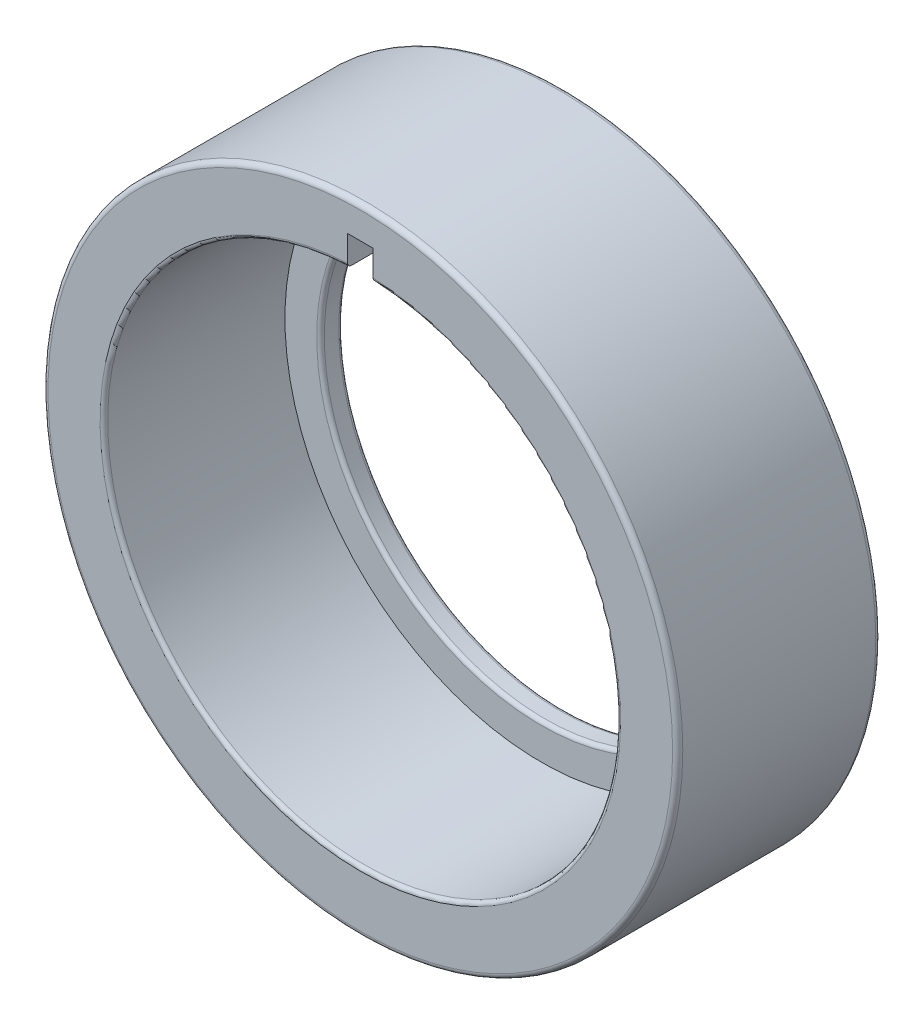
ISO-10303-21;
HEADER;
FILE_DESCRIPTION(('STEP AP214'),'2;1');
FILE_NAME('part.step','',(''),(''),'','','');
FILE_SCHEMA(('AUTOMOTIVE_DESIGN { 1 0 10303 214 1 1 1 1 }'));
ENDSEC;
DATA;
#1=APPLICATION_CONTEXT('core data for automotive mechanical design processes');
#2=APPLICATION_PROTOCOL_DEFINITION('international standard','automotive_design',2000,#1);
#3=PRODUCT_CONTEXT('',#1,'mechanical');
#4=PRODUCT('Part','Part','',(#3));
#5=PRODUCT_RELATED_PRODUCT_CATEGORY('part','',(#4));
#6=PRODUCT_DEFINITION_FORMATION('','',#4);
#7=PRODUCT_DEFINITION_CONTEXT('part definition',#1,'design');
#8=PRODUCT_DEFINITION('design','',#6,#7);
#9=PRODUCT_DEFINITION_SHAPE('','',#8);
#10=(LENGTH_UNIT() NAMED_UNIT(*) SI_UNIT(.MILLI.,.METRE.));
#11=(NAMED_UNIT(*) PLANE_ANGLE_UNIT() SI_UNIT($,.RADIAN.));
#12=(NAMED_UNIT(*) SI_UNIT($,.STERADIAN.) SOLID_ANGLE_UNIT());
#13=UNCERTAINTY_MEASURE_WITH_UNIT(LENGTH_MEASURE(1.E-05),#10,'distance_accuracy_value','');
#14=(GEOMETRIC_REPRESENTATION_CONTEXT(3) GLOBAL_UNCERTAINTY_ASSIGNED_CONTEXT((#13)) GLOBAL_UNIT_ASSIGNED_CONTEXT((#10,
#11,#12)) REPRESENTATION_CONTEXT('',''));
#15=CARTESIAN_POINT('',(0.,0.,0.));
#16=DIRECTION('',(0.,0.,1.));
#17=DIRECTION('',(1.,0.,0.));
#18=AXIS2_PLACEMENT_3D('',#15,#16,#17);
#19=CARTESIAN_POINT('',(0.,0.,80.0000000000001));
#20=DIRECTION('',(0.,0.,1.));
#21=DIRECTION('',(1.,0.,0.));
#22=AXIS2_PLACEMENT_3D('',#19,#20,#21);
#23=PLANE('',#22);
#24=DIRECTION('',(0.,1.,0.));
#25=VECTOR('',#24,1.);
#26=CARTESIAN_POINT('',(5.,112.5,79.9999999999998));
#27=LINE('',#26,#25);
#28=CARTESIAN_POINT('',(5.,102.377976147216,80.));
#29=VERTEX_POINT('',#28);
#30=CARTESIAN_POINT('',(5.,112.5,79.9999999999998));
#31=VERTEX_POINT('',#30);
#32=EDGE_CURVE('E84',#29,#31,#27,.T.);
#33=ORIENTED_EDGE('',*,*,#32,.F.);
#34=CARTESIAN_POINT('',(0.,0.,80.0000000000001));
#35=DIRECTION('',(0.,0.,1.));
#36=DIRECTION('',(1.,0.,0.));
#37=AXIS2_PLACEMENT_3D('',#34,#35,#36);
#38=CIRCLE('',#37,102.5);
#39=CARTESIAN_POINT('',(-5.00000000000006,102.377976147216,80.));
#40=VERTEX_POINT('',#39);
#41=EDGE_CURVE('E145',#29,#40,#38,.F.);
#42=ORIENTED_EDGE('',*,*,#41,.T.);
#43=DIRECTION('',(0.,-1.,0.));
#44=VECTOR('',#43,1.);
#45=CARTESIAN_POINT('',(-4.99999999999989,112.5,80.));
#46=LINE('',#45,#44);
#47=CARTESIAN_POINT('',(-4.99999999999989,112.5,80.));
#48=VERTEX_POINT('',#47);
#49=EDGE_CURVE('E54',#48,#40,#46,.T.);
#50=ORIENTED_EDGE('',*,*,#49,.F.);
#51=DIRECTION('',(-1.,0.,0.));
#52=VECTOR('',#51,1.);
#53=CARTESIAN_POINT('',(-4.99999999999989,112.5,80.));
#54=LINE('',#53,#52);
#55=EDGE_CURVE('E92',#31,#48,#54,.T.);
#56=ORIENTED_EDGE('',*,*,#55,.F.);
#57=EDGE_LOOP('',(#33,#42,#50,#56));
#58=FACE_BOUND('',#57,.T.);
#59=CARTESIAN_POINT('',(0.,0.,80.0000000000001));
#60=DIRECTION('',(0.,0.,1.));
#61=DIRECTION('',(1.,0.,0.));
#62=AXIS2_PLACEMENT_3D('',#59,#60,#61);
#63=CIRCLE('',#62,123.);
#64=CARTESIAN_POINT('',(123.,0.,80.0000000000001));
#65=VERTEX_POINT('',#64);
#66=EDGE_CURVE('E124',#65,#65,#63,.T.);
#67=ORIENTED_EDGE('',*,*,#66,.T.);
#68=EDGE_LOOP('',(#67));
#69=FACE_BOUND('',#68,.T.);
#70=ADVANCED_FACE('F34',(#58,#69),#23,.T.);
#71=CARTESIAN_POINT('',(0.,0.,0.));
#72=DIRECTION('',(0.,0.,1.));
#73=DIRECTION('',(1.,0.,0.));
#74=AXIS2_PLACEMENT_3D('',#71,#72,#73);
#75=PLANE('',#74);
#76=CARTESIAN_POINT('',(0.,0.,0.));
#77=DIRECTION('',(0.,0.,1.));
#78=DIRECTION('',(1.,0.,0.));
#79=AXIS2_PLACEMENT_3D('',#76,#77,#78);
#80=CIRCLE('',#79,88.5);
#81=CARTESIAN_POINT('',(88.5,0.,0.));
#82=VERTEX_POINT('',#81);
#83=EDGE_CURVE('E130',#82,#82,#80,.T.);
#84=ORIENTED_EDGE('',*,*,#83,.T.);
#85=EDGE_LOOP('',(#84));
#86=FACE_BOUND('',#85,.T.);
#87=CARTESIAN_POINT('',(0.,0.,0.));
#88=DIRECTION('',(0.,0.,1.));
#89=DIRECTION('',(1.,0.,0.));
#90=AXIS2_PLACEMENT_3D('',#87,#88,#89);
#91=CIRCLE('',#90,123.);
#92=CARTESIAN_POINT('',(123.,0.,0.));
#93=VERTEX_POINT('',#92);
#94=EDGE_CURVE('E121',#93,#93,#91,.F.);
#95=ORIENTED_EDGE('',*,*,#94,.T.);
#96=EDGE_LOOP('',(#95));
#97=FACE_BOUND('',#96,.T.);
#98=ADVANCED_FACE('F176',(#86,#97),#75,.F.);
#99=CARTESIAN_POINT('',(0.,0.,80.0000000000001));
#100=DIRECTION('',(0.,0.,-1.));
#101=DIRECTION('',(-1.,0.,0.));
#102=AXIS2_PLACEMENT_3D('',#99,#100,#101);
#103=CYLINDRICAL_SURFACE('',#102,125.);
#104=CARTESIAN_POINT('',(-1.11022302462516E-13,8.88178419700125E-13,2.00000000000022));
#105=DIRECTION('',(0.,0.,1.));
#106=DIRECTION('',(1.,0.,0.));
#107=AXIS2_PLACEMENT_3D('',#104,#105,#106);
#108=CIRCLE('',#107,125.);
#109=CARTESIAN_POINT('',(125.,8.84708972748172E-13,2.00000000000022));
#110=VERTEX_POINT('',#109);
#111=EDGE_CURVE('E118',#110,#110,#108,.T.);
#112=ORIENTED_EDGE('',*,*,#111,.T.);
#113=EDGE_LOOP('',(#112));
#114=FACE_BOUND('',#113,.T.);
#115=CARTESIAN_POINT('',(0.,8.88178419700125E-13,78.));
#116=DIRECTION('',(0.,0.,1.));
#117=DIRECTION('',(1.,0.,0.));
#118=AXIS2_PLACEMENT_3D('',#115,#116,#117);
#119=CIRCLE('',#118,125.);
#120=CARTESIAN_POINT('',(125.,8.84708972748172E-13,78.));
#121=VERTEX_POINT('',#120);
#122=EDGE_CURVE('E115',#121,#121,#119,.F.);
#123=ORIENTED_EDGE('',*,*,#122,.T.);
#124=EDGE_LOOP('',(#123));
#125=FACE_BOUND('',#124,.T.);
#126=ADVANCED_FACE('F172',(#114,#125),#103,.T.);
#127=CARTESIAN_POINT('',(0.,0.,80.0000000000001));
#128=DIRECTION('',(0.,0.,-1.));
#129=DIRECTION('',(-1.,0.,0.));
#130=AXIS2_PLACEMENT_3D('',#127,#128,#129);
#131=CYLINDRICAL_SURFACE('',#130,101.);
#132=DIRECTION('',(0.,0.,-1.));
#133=VECTOR('',#132,1.);
#134=CARTESIAN_POINT('',(4.99999999999995,100.876161703347,80.));
#135=LINE('',#134,#133);
#136=CARTESIAN_POINT('',(4.99999999999978,100.876161703348,8.70000000000004));
#137=VERTEX_POINT('',#136);
#138=CARTESIAN_POINT('',(4.99999999999978,100.876161703348,78.5));
#139=VERTEX_POINT('',#138);
#140=EDGE_CURVE('E61',#137,#139,#135,.F.);
#141=ORIENTED_EDGE('',*,*,#140,.F.);
#142=CARTESIAN_POINT('',(1.11022302462516E-13,-8.88178419700125E-13,8.70000000000004));
#143=DIRECTION('',(0.,0.,1.));
#144=DIRECTION('',(1.,0.,0.));
#145=AXIS2_PLACEMENT_3D('',#142,#143,#144);
#146=CIRCLE('',#145,101.);
#147=CARTESIAN_POINT('',(-4.99999999999995,100.876161703348,8.69999999999993));
#148=VERTEX_POINT('',#147);
#149=EDGE_CURVE('E127',#148,#137,#146,.T.);
#150=ORIENTED_EDGE('',*,*,#149,.F.);
#151=DIRECTION('',(0.,0.,-1.));
#152=VECTOR('',#151,1.);
#153=CARTESIAN_POINT('',(-5.,100.876161703348,80.));
#154=LINE('',#153,#152);
#155=CARTESIAN_POINT('',(-4.99999999999978,100.876161703348,78.5));
#156=VERTEX_POINT('',#155);
#157=EDGE_CURVE('E111',#156,#148,#154,.T.);
#158=ORIENTED_EDGE('',*,*,#157,.F.);
#159=CARTESIAN_POINT('',(0.,0.,78.4999999999998));
#160=DIRECTION('',(0.,0.,1.));
#161=DIRECTION('',(1.,0.,0.));
#162=AXIS2_PLACEMENT_3D('',#159,#160,#161);
#163=CIRCLE('',#162,101.);
#164=EDGE_CURVE('E142',#156,#139,#163,.T.);
#165=ORIENTED_EDGE('',*,*,#164,.T.);
#166=EDGE_LOOP('',(#141,#150,#158,#165));
#167=FACE_BOUND('',#166,.T.);
#168=ADVANCED_FACE('F168',(#167),#131,.F.);
#169=CARTESIAN_POINT('',(-1.11022302462516E-13,8.88178419700125E-13,2.00000000000022));
#170=DIRECTION('',(0.,0.,1.));
#171=DIRECTION('',(1.,0.,0.));
#172=AXIS2_PLACEMENT_3D('',#169,#170,#171);
#173=TOROIDAL_SURFACE('',#172,123.,2.);
#174=ORIENTED_EDGE('',*,*,#94,.F.);
#175=EDGE_LOOP('',(#174));
#176=FACE_BOUND('',#175,.T.);
#177=ORIENTED_EDGE('',*,*,#111,.F.);
#178=EDGE_LOOP('',(#177));
#179=FACE_BOUND('',#178,.T.);
#180=ADVANCED_FACE('F171',(#176,#179),#173,.T.);
#181=CARTESIAN_POINT('',(0.,8.88178419700125E-13,78.));
#182=DIRECTION('',(0.,0.,1.));
#183=DIRECTION('',(1.,0.,0.));
#184=AXIS2_PLACEMENT_3D('',#181,#182,#183);
#185=TOROIDAL_SURFACE('',#184,123.,2.);
#186=ORIENTED_EDGE('',*,*,#122,.F.);
#187=EDGE_LOOP('',(#186));
#188=FACE_BOUND('',#187,.T.);
#189=ORIENTED_EDGE('',*,*,#66,.F.);
#190=EDGE_LOOP('',(#189));
#191=FACE_BOUND('',#190,.T.);
#192=ADVANCED_FACE('F166',(#188,#191),#185,.T.);
#193=CARTESIAN_POINT('',(1.11022302462516E-13,-8.88178419700125E-13,8.70000000000004));
#194=DIRECTION('',(0.,0.,1.));
#195=DIRECTION('',(1.,0.,0.));
#196=AXIS2_PLACEMENT_3D('',#193,#194,#195);
#197=PLANE('',#196);
#198=ORIENTED_EDGE('',*,*,#149,.T.);
#199=DIRECTION('',(0.,-1.,0.));
#200=VECTOR('',#199,1.);
#201=CARTESIAN_POINT('',(4.99999999999995,112.5,8.70000000000004));
#202=LINE('',#201,#200);
#203=CARTESIAN_POINT('',(4.99999999999995,112.5,8.70000000000004));
#204=VERTEX_POINT('',#203);
#205=EDGE_CURVE('E112',#204,#137,#202,.T.);
#206=ORIENTED_EDGE('',*,*,#205,.F.);
#207=DIRECTION('',(1.,0.,0.));
#208=VECTOR('',#207,1.);
#209=CARTESIAN_POINT('',(-5.00000000000017,112.499999999999,8.69999999999982));
#210=LINE('',#209,#208);
#211=CARTESIAN_POINT('',(-5.00000000000017,112.499999999999,8.69999999999982));
#212=VERTEX_POINT('',#211);
#213=EDGE_CURVE('E99',#212,#204,#210,.T.);
#214=ORIENTED_EDGE('',*,*,#213,.F.);
#215=DIRECTION('',(0.,1.,0.));
#216=VECTOR('',#215,1.);
#217=CARTESIAN_POINT('',(-5.00000000000017,112.499999999999,8.69999999999982));
#218=LINE('',#217,#216);
#219=EDGE_CURVE('E108',#148,#212,#218,.T.);
#220=ORIENTED_EDGE('',*,*,#219,.F.);
#221=EDGE_LOOP('',(#198,#206,#214,#220));
#222=FACE_BOUND('',#221,.T.);
#223=CARTESIAN_POINT('',(1.11022302462516E-13,-8.88178419700125E-13,8.70000000000004));
#224=DIRECTION('',(0.,0.,1.));
#225=DIRECTION('',(1.,0.,0.));
#226=AXIS2_PLACEMENT_3D('',#223,#224,#225);
#227=CIRCLE('',#226,88.5);
#228=CARTESIAN_POINT('',(88.5000000000001,-8.90634788142108E-13,8.70000000000004));
#229=VERTEX_POINT('',#228);
#230=EDGE_CURVE('E139',#229,#229,#227,.F.);
#231=ORIENTED_EDGE('',*,*,#230,.T.);
#232=EDGE_LOOP('',(#231));
#233=FACE_BOUND('',#232,.T.);
#234=ADVANCED_FACE('F162',(#222,#233),#197,.T.);
#235=CARTESIAN_POINT('',(1.11022302462516E-13,-8.88178419700125E-13,8.70000000000004));
#236=DIRECTION('',(0.,0.,-1.));
#237=DIRECTION('',(-1.,0.,0.));
#238=AXIS2_PLACEMENT_3D('',#235,#236,#237);
#239=CYLINDRICAL_SURFACE('',#238,87.);
#240=CARTESIAN_POINT('',(0.,0.,1.50000000000017));
#241=DIRECTION('',(0.,0.,1.));
#242=DIRECTION('',(1.,0.,0.));
#243=AXIS2_PLACEMENT_3D('',#240,#241,#242);
#244=CIRCLE('',#243,87.);
#245=CARTESIAN_POINT('',(86.9999999999999,0.,1.50000000000017));
#246=VERTEX_POINT('',#245);
#247=EDGE_CURVE('E136',#246,#246,#244,.F.);
#248=ORIENTED_EDGE('',*,*,#247,.T.);
#249=EDGE_LOOP('',(#248));
#250=FACE_BOUND('',#249,.T.);
#251=CARTESIAN_POINT('',(0.,-8.88178419700125E-13,7.19999999999998));
#252=DIRECTION('',(0.,0.,1.));
#253=DIRECTION('',(1.,0.,0.));
#254=AXIS2_PLACEMENT_3D('',#251,#252,#253);
#255=CIRCLE('',#254,87.);
#256=CARTESIAN_POINT('',(87.,-8.90593154778685E-13,7.19999999999998));
#257=VERTEX_POINT('',#256);
#258=EDGE_CURVE('E133',#257,#257,#255,.T.);
#259=ORIENTED_EDGE('',*,*,#258,.T.);
#260=EDGE_LOOP('',(#259));
#261=FACE_BOUND('',#260,.T.);
#262=ADVANCED_FACE('F158',(#250,#261),#239,.F.);
#263=CARTESIAN_POINT('',(0.,0.,1.50000000000017));
#264=DIRECTION('',(0.,0.,1.));
#265=DIRECTION('',(1.,0.,0.));
#266=AXIS2_PLACEMENT_3D('',#263,#264,#265);
#267=TOROIDAL_SURFACE('',#266,88.5,1.5);
#268=ORIENTED_EDGE('',*,*,#247,.F.);
#269=EDGE_LOOP('',(#268));
#270=FACE_BOUND('',#269,.T.);
#271=ORIENTED_EDGE('',*,*,#83,.F.);
#272=EDGE_LOOP('',(#271));
#273=FACE_BOUND('',#272,.T.);
#274=ADVANCED_FACE('F161',(#270,#273),#267,.T.);
#275=CARTESIAN_POINT('',(0.,-8.88178419700125E-13,7.19999999999998));
#276=DIRECTION('',(0.,0.,1.));
#277=DIRECTION('',(1.,0.,0.));
#278=AXIS2_PLACEMENT_3D('',#275,#276,#277);
#279=TOROIDAL_SURFACE('',#278,88.5,1.5);
#280=ORIENTED_EDGE('',*,*,#230,.F.);
#281=EDGE_LOOP('',(#280));
#282=FACE_BOUND('',#281,.T.);
#283=ORIENTED_EDGE('',*,*,#258,.F.);
#284=EDGE_LOOP('',(#283));
#285=FACE_BOUND('',#284,.T.);
#286=ADVANCED_FACE('F190',(#282,#285),#279,.T.);
#287=CARTESIAN_POINT('',(0.,0.,78.4999999999998));
#288=DIRECTION('',(0.,0.,1.));
#289=DIRECTION('',(1.,0.,0.));
#290=AXIS2_PLACEMENT_3D('',#287,#288,#289);
#291=TOROIDAL_SURFACE('',#290,102.5,1.5);
#292=CARTESIAN_POINT('',(5.00000000000023,100.906735427476,78.8011250281984));
#293=CARTESIAN_POINT('',(5.00000000000028,100.92366588935,78.8836242589373));
#294=CARTESIAN_POINT('',(5.00000000000001,100.947580320698,78.9647531314365));
#295=CARTESIAN_POINT('',(4.99999999999989,101.008715971521,79.1219092833024));
#296=CARTESIAN_POINT('',(5.00000000000004,101.045953263009,79.1979302686368));
#297=CARTESIAN_POINT('',(5.00000000000008,101.13264619689,79.3426086121512));
#298=CARTESIAN_POINT('',(4.99999999999999,101.182095490115,79.4112697702776));
#299=CARTESIAN_POINT('',(4.99999999999991,101.291797995982,79.5393042626004));
#300=CARTESIAN_POINT('',(4.99999999999994,101.352048541596,79.598679882806));
#301=CARTESIAN_POINT('',(4.99999999999996,101.481706825067,79.7065390008369));
#302=CARTESIAN_POINT('',(4.99999999999995,101.551122528464,79.7550129236582));
#303=CARTESIAN_POINT('',(4.99999999999995,101.69710186421,79.8396365457809));
#304=CARTESIAN_POINT('',(4.99999999999997,101.77366582174,79.8757856840651));
#305=CARTESIAN_POINT('',(4.99999999999993,101.931860233233,79.9347736552695));
#306=CARTESIAN_POINT('',(4.99999999999987,102.013496391489,79.9575971908236));
#307=CARTESIAN_POINT('',(5.00000000000003,102.179440442432,79.9892265138763));
#308=CARTESIAN_POINT('',(5.00000000000025,102.263748343571,79.998032257031));
#309=CARTESIAN_POINT('',(5.00000000000021,102.432711972686,80.0013792074025));
#310=CARTESIAN_POINT('',(4.99999999999995,102.517367918306,79.9959094385945));
#311=CARTESIAN_POINT('',(4.99999999999995,102.684560201741,79.9708358846985));
#312=CARTESIAN_POINT('',(5.00000000000019,102.767096540441,79.951232105515));
#313=CARTESIAN_POINT('',(5.00000000000026,102.927709001334,79.8984419917115));
#314=CARTESIAN_POINT('',(5.00000000000007,103.005784934691,79.8652550825201));
#315=CARTESIAN_POINT('',(4.99999999999983,103.155251801036,79.7862357431534));
#316=CARTESIAN_POINT('',(4.99999999999976,103.22664274553,79.7404033347458));
#317=CARTESIAN_POINT('',(4.9999999999998,103.360658794421,79.6374254959003));
#318=CARTESIAN_POINT('',(4.99999999999991,103.423289882729,79.5802878532008));
#319=CARTESIAN_POINT('',(4.99999999999999,103.538057433856,79.4562983263662));
#320=CARTESIAN_POINT('',(4.99999999999996,103.590193960864,79.3894465016507));
#321=CARTESIAN_POINT('',(4.99999999999993,103.682430872729,79.2480051473123));
#322=CARTESIAN_POINT('',(4.99999999999993,103.722544481405,79.1734242412407));
#323=CARTESIAN_POINT('',(4.99999999999997,103.789666199152,79.0185813805068));
#324=CARTESIAN_POINT('',(5.00000000000001,103.816674386956,78.9383194599772));
#325=CARTESIAN_POINT('',(5.,103.856791081877,78.774482993789));
#326=CARTESIAN_POINT('',(4.99999999999995,103.869914061219,78.6909119915766));
#327=CARTESIAN_POINT('',(4.99999999999995,103.881934958774,78.52275322862));
#328=CARTESIAN_POINT('',(5.,103.880832933968,78.4381654719498));
#329=CARTESIAN_POINT('',(5.00000000000001,103.864439933882,78.2704226556322));
#330=CARTESIAN_POINT('',(4.99999999999997,103.849156624068,78.1872668467));
#331=CARTESIAN_POINT('',(4.99999999999993,103.804848738123,78.0247006725642));
#332=CARTESIAN_POINT('',(4.99999999999993,103.775824163246,77.9452903070188));
#333=CARTESIAN_POINT('',(4.99999999999996,103.704855397974,77.7924514498471));
#334=CARTESIAN_POINT('',(4.99999999999999,103.66290877422,77.7190240881801));
#335=CARTESIAN_POINT('',(4.99999999999991,103.567293264898,77.5802460714351));
#336=CARTESIAN_POINT('',(4.99999999999979,103.513624337079,77.5148954454701));
#337=CARTESIAN_POINT('',(4.99999999999977,103.396041162196,77.3940659969218));
#338=CARTESIAN_POINT('',(4.99999999999987,103.332118371461,77.3385954886558));
#339=CARTESIAN_POINT('',(5.00000000000003,103.19587635991,77.2391589201687));
#340=CARTESIAN_POINT('',(5.00000000000008,103.123557084828,77.1951929343053));
#341=CARTESIAN_POINT('',(5.00000000000004,102.972487038987,77.1199608023347));
#342=CARTESIAN_POINT('',(4.99999999999995,102.893729057598,77.0887091354455));
#343=CARTESIAN_POINT('',(4.99999999999995,102.732087321638,77.0398575319906));
#344=CARTESIAN_POINT('',(5.00000000000004,102.64920354741,77.022257660475));
#345=CARTESIAN_POINT('',(5.00000000000008,102.481578705035,77.0011946381986));
#346=CARTESIAN_POINT('',(5.00000000000002,102.396835949978,76.9977449105662));
#347=CARTESIAN_POINT('',(4.99999999999987,102.227973052391,77.0051160556692));
#348=CARTESIAN_POINT('',(4.99999999999978,102.1438529129,77.015936997993));
#349=CARTESIAN_POINT('',(4.99999999999979,101.978593602784,77.0515507063783));
#350=CARTESIAN_POINT('',(4.9999999999999,101.897455464684,77.0763482642179));
#351=CARTESIAN_POINT('',(5.,101.740496372172,77.1392190272556));
#352=CARTESIAN_POINT('',(4.99999999999998,101.664675422014,77.1772922430746));
#353=CARTESIAN_POINT('',(4.99999999999992,101.520538443417,77.2656201750011));
#354=CARTESIAN_POINT('',(4.99999999999987,101.452219374224,77.3158699288849));
#355=CARTESIAN_POINT('',(5.00000000000003,101.325000789464,77.4271350245627));
#356=CARTESIAN_POINT('',(5.00000000000025,101.266100857228,77.488149889897));
#357=CARTESIAN_POINT('',(5.00000000000021,101.159460266123,77.6191409383178));
#358=CARTESIAN_POINT('',(4.99999999999995,101.111707087302,77.6891069294342));
#359=CARTESIAN_POINT('',(4.99999999999995,101.02862930102,77.8360903582158));
#360=CARTESIAN_POINT('',(5.0000000000002,100.993307709786,77.9131095014551));
#361=CARTESIAN_POINT('',(5.00000000000025,100.936140355934,78.0719275874895));
#362=CARTESIAN_POINT('',(5.00000000000006,100.914285253943,78.1537231744943));
#363=CARTESIAN_POINT('',(4.99999999999984,100.884660631729,78.3197564902019));
#364=CARTESIAN_POINT('',(4.99999999999983,100.876874081325,78.403991140652));
#365=CARTESIAN_POINT('',(4.99999999999984,100.875792783148,78.540729452473));
#366=CARTESIAN_POINT('',(4.99999999999986,100.87814483608,78.5932364524994));
#367=CARTESIAN_POINT('',(5.00000000000004,100.888338044528,78.6977148904274));
#368=CARTESIAN_POINT('',(5.00000000000019,100.896179196427,78.749686328682));
#369=CARTESIAN_POINT('',(5.00000000000023,100.906735427476,78.8011250281984));
#370=B_SPLINE_CURVE_WITH_KNOTS('',3,(#292,#293,#294,#295,#296,#297,#298,#299,#300,#301,#302,
#303,#304,#305,#306,#307,#308,#309,#310,#311,#312,#313,#314,#315,#316,#317,#318,#319,#320,#321,
#322,#323,#324,#325,#326,#327,#328,#329,#330,#331,#332,#333,#334,#335,#336,#337,#338,#339,#340,
#341,#342,#343,#344,#345,#346,#347,#348,#349,#350,#351,#352,#353,#354,#355,#356,#357,#358,#359,
#360,#361,#362,#363,#364,#365,#366,#367,#368,#369),.UNSPECIFIED.,.T.,.F.,(4,2,2,2,2,2,2,2,2,2,2,
2,2,2,2,2,2,2,2,2,2,2,2,2,2,2,2,2,2,2,2,2,2,2,2,2,2,2,4),(0.,0.252463756322641,
0.505233104523775,0.757871310505441,1.01044722117083,1.26324411135455,1.51605250717643,
1.76915055121863,2.02224939590871,2.27554289823693,2.52883629475025,2.78214040677349,
3.03544408276458,3.28857387137231,3.54170211169986,3.79455090984385,4.0473981889433,
4.2999816709232,4.55256414114627,4.80501016144767,5.05745615870118,5.30994972331344,
5.56244419802914,5.81515015823704,6.06785775173401,6.32085233146454,6.57384811669446,
6.8270838436991,7.08032080556653,7.33364464069051,7.58696867848039,7.84018965391296,
8.09339942469134,8.3463234087286,8.5993087164781,8.85211837402911,9.10462179634169,
9.26203436542437,9.4194468307765),.UNSPECIFIED.);
#371=EDGE_CURVE('E11',#139,#29,#370,.T.);
#372=ORIENTED_EDGE('',*,*,#371,.F.);
#373=ORIENTED_EDGE('',*,*,#164,.F.);
#374=CARTESIAN_POINT('',(-5.,100.906735427476,78.8011250281982));
#375=CARTESIAN_POINT('',(-4.99999999999998,100.889823932329,78.7186809310915));
#376=CARTESIAN_POINT('',(-5.00000000000017,100.879862248302,78.6347487752833));
#377=CARTESIAN_POINT('',(-5.00000000000006,100.8741666766,78.4663338101945));
#378=CARTESIAN_POINT('',(-4.99999999999978,100.8784498577,78.381850461456));
#379=CARTESIAN_POINT('',(-4.99999999999979,100.901140878176,78.2148361081134));
#380=CARTESIAN_POINT('',(-5.00000000000007,100.919541883403,78.1323041787878));
#381=CARTESIAN_POINT('',(-5.00000000000016,100.969931246602,77.9715228072206));
#382=CARTESIAN_POINT('',(-4.99999999999995,101.001916260927,77.8932723164673));
#383=CARTESIAN_POINT('',(-4.99999999999995,101.078572687838,77.7432197748737));
#384=CARTESIAN_POINT('',(-5.00000000000015,101.12324843647,77.6714199390855));
#385=CARTESIAN_POINT('',(-5.00000000000008,101.224010946209,77.53632784817));
#386=CARTESIAN_POINT('',(-4.9999999999998,101.280098199448,77.4730359601528));
#387=CARTESIAN_POINT('',(-4.99999999999977,101.402145371748,77.3566946508804));
#388=CARTESIAN_POINT('',(-5.00000000000002,101.468114502964,77.3036548937462));
#389=CARTESIAN_POINT('',(-5.00000000000021,101.608012107654,77.2093879916658));
#390=CARTESIAN_POINT('',(-5.00000000000015,101.681940617501,77.1681609007052));
#391=CARTESIAN_POINT('',(-5.00000000000008,101.835752607538,77.098638568724));
#392=CARTESIAN_POINT('',(-5.00000000000008,101.915643043504,77.0703587164879));
#393=CARTESIAN_POINT('',(-5.00000000000015,102.079035360588,77.0275995489266));
#394=CARTESIAN_POINT('',(-5.00000000000022,102.162537255332,77.0131202856788));
#395=CARTESIAN_POINT('',(-5.00000000000023,102.33086117035,76.9983634079006));
#396=CARTESIAN_POINT('',(-5.00000000000016,102.415684290544,76.9980983368767));
#397=CARTESIAN_POINT('',(-5.00000000000007,102.584171910361,77.0118093112248));
#398=CARTESIAN_POINT('',(-5.00000000000004,102.667836406149,77.0257854037219));
#399=CARTESIAN_POINT('',(-5.00000000000008,102.831648162665,77.0675893173617));
#400=CARTESIAN_POINT('',(-5.00000000000014,102.911794721707,77.0954198883746));
#401=CARTESIAN_POINT('',(-5.00000000000009,103.066274148836,77.1641487516953));
#402=CARTESIAN_POINT('',(-4.99999999999996,103.140607030847,77.2050470127023));
#403=CARTESIAN_POINT('',(-4.99999999999994,103.281302958313,77.2987286410171));
#404=CARTESIAN_POINT('',(-5.00000000000004,103.347670413579,77.3515053852005));
#405=CARTESIAN_POINT('',(-5.00000000000019,103.47059114893,77.4674626907262));
#406=CARTESIAN_POINT('',(-5.00000000000024,103.527144479734,77.5306431982981));
#407=CARTESIAN_POINT('',(-5.00000000000021,103.628767224334,77.6655435929438));
#408=CARTESIAN_POINT('',(-5.00000000000014,103.673848703321,77.7372543910321));
#409=CARTESIAN_POINT('',(-5.00000000000009,103.751317187568,77.8872331199514));
#410=CARTESIAN_POINT('',(-5.00000000000011,103.783704273057,77.9655010093376));
#411=CARTESIAN_POINT('',(-5.00000000000012,103.834828811523,78.1262799592405));
#412=CARTESIAN_POINT('',(-5.00000000000012,103.853581173307,78.208786279219));
#413=CARTESIAN_POINT('',(-5.00000000000011,103.876957770797,78.3757765921762));
#414=CARTESIAN_POINT('',(-5.00000000000011,103.881582070477,78.4602605761979));
#415=CARTESIAN_POINT('',(-5.00000000000012,103.876572009836,78.6287479176598));
#416=CARTESIAN_POINT('',(-5.00000000000013,103.866947173936,78.7127515585036));
#417=CARTESIAN_POINT('',(-5.0000000000001,103.833731443585,78.8779505347036));
#418=CARTESIAN_POINT('',(-5.00000000000006,103.810140564409,78.9591458731312));
#419=CARTESIAN_POINT('',(-5.00000000000006,103.749665321343,79.1164283326499));
#420=CARTESIAN_POINT('',(-5.00000000000012,103.712780447653,79.1925152577096));
#421=CARTESIAN_POINT('',(-5.00000000000011,103.626769210054,79.3374228307399));
#422=CARTESIAN_POINT('',(-5.00000000000006,103.577642804002,79.4062434536942));
#423=CARTESIAN_POINT('',(-5.00000000000006,103.468506742333,79.5347200949702));
#424=CARTESIAN_POINT('',(-5.00000000000011,103.408489182246,79.5943693985604));
#425=CARTESIAN_POINT('',(-5.00000000000012,103.2793014981,79.702758824008));
#426=CARTESIAN_POINT('',(-5.00000000000009,103.210131330869,79.7514988944055));
#427=CARTESIAN_POINT('',(-5.00000000000014,103.064519665004,79.8367441817799));
#428=CARTESIAN_POINT('',(-5.00000000000021,102.988070162586,79.8732357270978));
#429=CARTESIAN_POINT('',(-5.00000000000002,102.830133980514,79.9328811990988));
#430=CARTESIAN_POINT('',(-4.99999999999976,102.748647261014,79.9560350202626));
#431=CARTESIAN_POINT('',(-4.99999999999981,102.582860450422,79.9883701861747));
#432=CARTESIAN_POINT('',(-5.00000000000012,102.498557566763,79.9975372140896));
#433=CARTESIAN_POINT('',(-5.00000000000011,102.329608568253,80.0015955881982));
#434=CARTESIAN_POINT('',(-4.99999999999978,102.244962451436,79.996486852493));
#435=CARTESIAN_POINT('',(-4.99999999999978,102.077684987519,79.9721314480793));
#436=CARTESIAN_POINT('',(-5.00000000000011,101.995054686167,79.9528775959301));
#437=CARTESIAN_POINT('',(-5.00000000000012,101.834203837985,79.9007676829785));
#438=CARTESIAN_POINT('',(-4.99999999999982,101.755983117257,79.8679121590092));
#439=CARTESIAN_POINT('',(-4.99999999999975,101.606201334534,79.7895425002623));
#440=CARTESIAN_POINT('',(-4.99999999999999,101.534637763405,79.7440331608207));
#441=CARTESIAN_POINT('',(-5.00000000000024,101.400157346662,79.6416217102797));
#442=CARTESIAN_POINT('',(-5.00000000000024,101.33724261819,79.5847168180189));
#443=CARTESIAN_POINT('',(-5.00000000000021,101.221907281101,79.4611734468448));
#444=CARTESIAN_POINT('',(-5.00000000000018,101.16948190815,79.3945394108708));
#445=CARTESIAN_POINT('',(-5.00000000000005,101.076632821923,79.2534564538773));
#446=CARTESIAN_POINT('',(-4.99999999999996,101.036194648373,79.179017096518));
#447=CARTESIAN_POINT('',(-5.00000000000003,100.981153767412,79.053512812148));
#448=CARTESIAN_POINT('',(-5.00000000000012,100.962550858799,79.0041611784618));
#449=CARTESIAN_POINT('',(-5.00000000000011,100.930635709305,78.903775803045));
#450=CARTESIAN_POINT('',(-5.00000000000002,100.917323465337,78.8527420622961));
#451=CARTESIAN_POINT('',(-5.,100.906735427476,78.8011250281982));
#452=B_SPLINE_CURVE_WITH_KNOTS('',3,(#374,#375,#376,#377,#378,#379,#380,#381,#382,#383,#384,
#385,#386,#387,#388,#389,#390,#391,#392,#393,#394,#395,#396,#397,#398,#399,#400,#401,#402,#403,
#404,#405,#406,#407,#408,#409,#410,#411,#412,#413,#414,#415,#416,#417,#418,#419,#420,#421,#422,
#423,#424,#425,#426,#427,#428,#429,#430,#431,#432,#433,#434,#435,#436,#437,#438,#439,#440,#441,
#442,#443,#444,#445,#446,#447,#448,#449,#450,#451),.UNSPECIFIED.,.T.,.F.,(4,2,2,2,2,2,2,2,2,2,2,
2,2,2,2,2,2,2,2,2,2,2,2,2,2,2,2,2,2,2,2,2,2,2,2,2,2,2,4),(0.,0.252289847860046,
0.504882108502308,0.757352171505927,1.00976012602436,1.26225442476868,1.51475961491823,
1.76750167931411,2.02024489875871,2.27328774791714,2.52633155194466,2.77959865423607,
3.03286659461337,3.28618482427626,3.53950244717499,3.79267917531821,4.04585459499377,
4.29876263381382,4.55166907421834,4.80429855797475,5.05692689778319,5.30938645175223,
5.56184572960846,5.81431468986458,6.0667845192853,6.31943832183927,6.57209331616096,
6.82502939041735,7.07796746571106,7.331164274264,7.58436253538928,7.83768946940782,
8.09100640602644,8.34422747526646,8.59751042029346,8.85067806006473,9.10353904672068,
9.26149409428781,9.41944904966404),.UNSPECIFIED.);
#453=EDGE_CURVE('E47',#40,#156,#452,.T.);
#454=ORIENTED_EDGE('',*,*,#453,.F.);
#455=ORIENTED_EDGE('',*,*,#41,.F.);
#456=EDGE_LOOP('',(#372,#373,#454,#455));
#457=FACE_BOUND('',#456,.T.);
#458=ADVANCED_FACE('F36',(#457),#291,.T.);
#459=CARTESIAN_POINT('',(4.99999999999995,112.5,-27.7005494464028));
#460=DIRECTION('',(0.999999999999999,0.,0.));
#461=DIRECTION('',(0.,1.,0.));
#462=AXIS2_PLACEMENT_3D('',#459,#460,#461);
#463=PLANE('',#462);
#464=ORIENTED_EDGE('',*,*,#140,.T.);
#465=ORIENTED_EDGE('',*,*,#371,.T.);
#466=ORIENTED_EDGE('',*,*,#32,.T.);
#467=DIRECTION('',(0.,0.,1.));
#468=VECTOR('',#467,1.);
#469=CARTESIAN_POINT('',(4.99999999999995,112.5,-27.7005494464028));
#470=LINE('',#469,#468);
#471=EDGE_CURVE('E87',#204,#31,#470,.T.);
#472=ORIENTED_EDGE('',*,*,#471,.F.);
#473=ORIENTED_EDGE('',*,*,#205,.T.);
#474=EDGE_LOOP('',(#464,#465,#466,#472,#473));
#475=FACE_BOUND('',#474,.T.);
#476=ADVANCED_FACE('F86',(#475),#463,.F.);
#477=CARTESIAN_POINT('',(-5.00000000000012,112.5,-27.7005494464025));
#478=DIRECTION('',(-0.999999999999999,0.,0.));
#479=DIRECTION('',(0.,-1.,0.));
#480=AXIS2_PLACEMENT_3D('',#477,#478,#479);
#481=PLANE('',#480);
#482=ORIENTED_EDGE('',*,*,#157,.T.);
#483=ORIENTED_EDGE('',*,*,#219,.T.);
#484=DIRECTION('',(0.,0.,1.));
#485=VECTOR('',#484,1.);
#486=CARTESIAN_POINT('',(-5.00000000000012,112.5,-27.7005494464025));
#487=LINE('',#486,#485);
#488=EDGE_CURVE('E101',#212,#48,#487,.T.);
#489=ORIENTED_EDGE('',*,*,#488,.T.);
#490=ORIENTED_EDGE('',*,*,#49,.T.);
#491=ORIENTED_EDGE('',*,*,#453,.T.);
#492=EDGE_LOOP('',(#482,#483,#489,#490,#491));
#493=FACE_BOUND('',#492,.T.);
#494=ADVANCED_FACE('F150',(#493),#481,.F.);
#495=CARTESIAN_POINT('',(-5.00000000000012,112.5,-27.7005494464025));
#496=DIRECTION('',(0.,1.,0.));
#497=DIRECTION('',(0.,0.,1.));
#498=AXIS2_PLACEMENT_3D('',#495,#496,#497);
#499=PLANE('',#498);
#500=ORIENTED_EDGE('',*,*,#213,.T.);
#501=ORIENTED_EDGE('',*,*,#471,.T.);
#502=ORIENTED_EDGE('',*,*,#55,.T.);
#503=ORIENTED_EDGE('',*,*,#488,.F.);
#504=EDGE_LOOP('',(#500,#501,#502,#503));
#505=FACE_BOUND('',#504,.T.);
#506=ADVANCED_FACE('F96',(#505),#499,.F.);
#507=CLOSED_SHELL('',(#70,#98,#126,#168,#180,#192,#234,#262,#274,#286,#458,#476,#494,#506));
#508=MANIFOLD_SOLID_BREP('B2',#507);
#509=ADVANCED_BREP_SHAPE_REPRESENTATION('',(#18,#508),#14);
#510=SHAPE_DEFINITION_REPRESENTATION(#9,#509);
ENDSEC;
END-ISO-10303-21;
